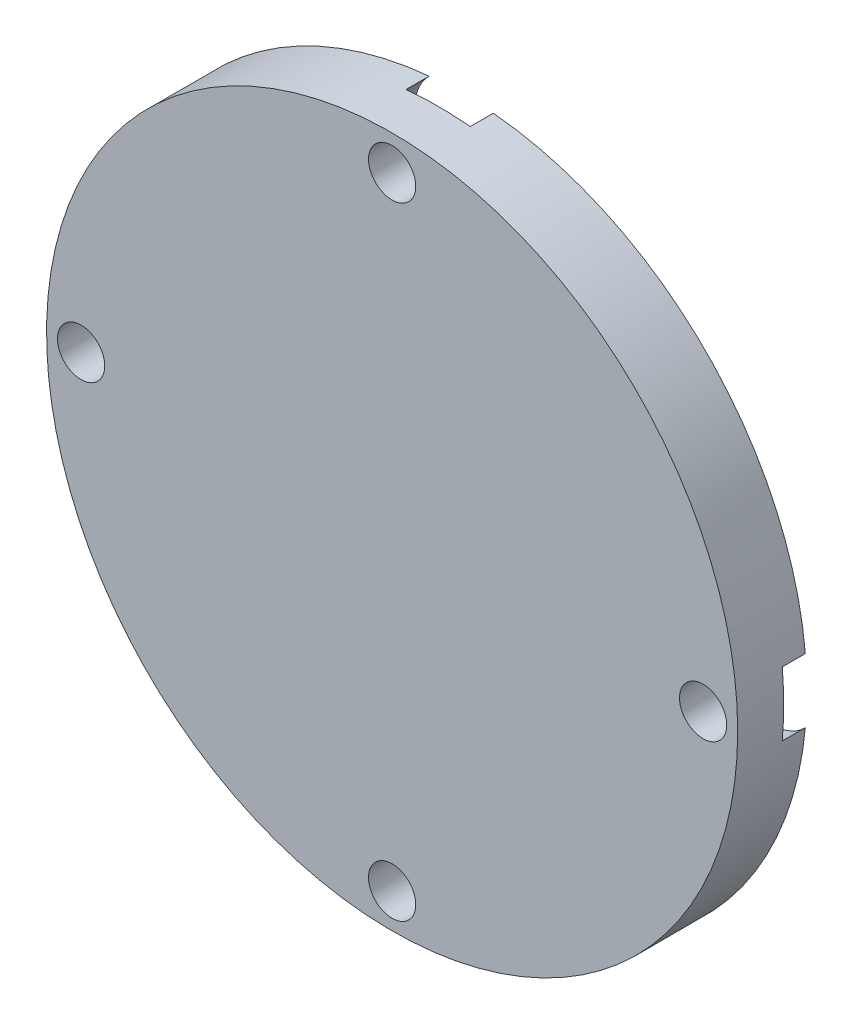
ISO-10303-21;
HEADER;
FILE_DESCRIPTION(('STEP AP214'),'2;1');
FILE_NAME('part.step','',(''),(''),'','','');
FILE_SCHEMA(('AUTOMOTIVE_DESIGN { 1 0 10303 214 1 1 1 1 }'));
ENDSEC;
DATA;
#1=APPLICATION_CONTEXT('core data for automotive mechanical design processes');
#2=APPLICATION_PROTOCOL_DEFINITION('international standard','automotive_design',2000,#1);
#3=PRODUCT_CONTEXT('',#1,'mechanical');
#4=PRODUCT('Part','Part','',(#3));
#5=PRODUCT_RELATED_PRODUCT_CATEGORY('part','',(#4));
#6=PRODUCT_DEFINITION_FORMATION('','',#4);
#7=PRODUCT_DEFINITION_CONTEXT('part definition',#1,'design');
#8=PRODUCT_DEFINITION('design','',#6,#7);
#9=PRODUCT_DEFINITION_SHAPE('','',#8);
#10=(LENGTH_UNIT() NAMED_UNIT(*) SI_UNIT(.MILLI.,.METRE.));
#11=(NAMED_UNIT(*) PLANE_ANGLE_UNIT() SI_UNIT($,.RADIAN.));
#12=(NAMED_UNIT(*) SI_UNIT($,.STERADIAN.) SOLID_ANGLE_UNIT());
#13=UNCERTAINTY_MEASURE_WITH_UNIT(LENGTH_MEASURE(1.E-05),#10,'distance_accuracy_value','');
#14=(GEOMETRIC_REPRESENTATION_CONTEXT(3) GLOBAL_UNCERTAINTY_ASSIGNED_CONTEXT((#13)) GLOBAL_UNIT_ASSIGNED_CONTEXT((#10,
#11,#12)) REPRESENTATION_CONTEXT('',''));
#15=CARTESIAN_POINT('',(0.,0.,0.));
#16=DIRECTION('',(0.,0.,1.));
#17=DIRECTION('',(1.,0.,0.));
#18=AXIS2_PLACEMENT_3D('',#15,#16,#17);
#19=CARTESIAN_POINT('',(-13.4999999999996,-3.8286644072103E-13,3.));
#20=DIRECTION('',(0.,0.,-1.));
#21=DIRECTION('',(-1.,0.,0.));
#22=AXIS2_PLACEMENT_3D('',#19,#20,#21);
#23=CYLINDRICAL_SURFACE('',#22,1.02500000000061);
#24=CARTESIAN_POINT('',(-13.4999999999996,-3.8286644072103E-13,3.));
#25=DIRECTION('',(0.,0.,1.));
#26=DIRECTION('',(1.,0.,0.));
#27=AXIS2_PLACEMENT_3D('',#24,#25,#26);
#28=CIRCLE('',#27,1.02500000000061);
#29=CARTESIAN_POINT('',(-12.474999999999,-3.8286644072103E-13,3.));
#30=VERTEX_POINT('',#29);
#31=EDGE_CURVE('E172',#30,#30,#28,.T.);
#32=ORIENTED_EDGE('',*,*,#31,.T.);
#33=EDGE_LOOP('',(#32));
#34=FACE_BOUND('',#33,.T.);
#35=CARTESIAN_POINT('',(-13.4999999999996,-3.8286644072103E-13,1.));
#36=DIRECTION('',(0.,0.,-1.));
#37=DIRECTION('',(-1.,0.,0.));
#38=AXIS2_PLACEMENT_3D('',#35,#36,#37);
#39=CIRCLE('',#38,1.02500000000061);
#40=CARTESIAN_POINT('',(-14.5250000000002,-3.8286644072103E-13,1.));
#41=VERTEX_POINT('',#40);
#42=EDGE_CURVE('E40',#41,#41,#39,.T.);
#43=ORIENTED_EDGE('',*,*,#42,.T.);
#44=EDGE_LOOP('',(#43));
#45=FACE_BOUND('',#44,.T.);
#46=ADVANCED_FACE('F36',(#34,#45),#23,.F.);
#47=CARTESIAN_POINT('',(7.62426335084362E-13,-13.5,3.));
#48=DIRECTION('',(0.,0.,-1.));
#49=DIRECTION('',(-1.,0.,0.));
#50=AXIS2_PLACEMENT_3D('',#47,#48,#49);
#51=CYLINDRICAL_SURFACE('',#50,1.02500000000082);
#52=CARTESIAN_POINT('',(7.62426335084362E-13,-13.5,3.));
#53=DIRECTION('',(0.,0.,1.));
#54=DIRECTION('',(1.,0.,0.));
#55=AXIS2_PLACEMENT_3D('',#52,#53,#54);
#56=CIRCLE('',#55,1.02500000000082);
#57=CARTESIAN_POINT('',(1.02500000000158,-13.5,3.));
#58=VERTEX_POINT('',#57);
#59=EDGE_CURVE('E179',#58,#58,#56,.T.);
#60=ORIENTED_EDGE('',*,*,#59,.T.);
#61=EDGE_LOOP('',(#60));
#62=FACE_BOUND('',#61,.T.);
#63=CARTESIAN_POINT('',(7.62426335084362E-13,-13.5,1.));
#64=DIRECTION('',(0.,0.,-1.));
#65=DIRECTION('',(-1.,0.,0.));
#66=AXIS2_PLACEMENT_3D('',#63,#64,#65);
#67=CIRCLE('',#66,1.02500000000082);
#68=CARTESIAN_POINT('',(-1.02500000000006,-13.5,1.));
#69=VERTEX_POINT('',#68);
#70=EDGE_CURVE('E144',#69,#69,#67,.T.);
#71=ORIENTED_EDGE('',*,*,#70,.T.);
#72=EDGE_LOOP('',(#71));
#73=FACE_BOUND('',#72,.T.);
#74=ADVANCED_FACE('F201',(#62,#73),#51,.F.);
#75=CARTESIAN_POINT('',(13.5000000000004,3.81213167542181E-13,3.));
#76=DIRECTION('',(0.,0.,-1.));
#77=DIRECTION('',(-1.,0.,0.));
#78=AXIS2_PLACEMENT_3D('',#75,#76,#77);
#79=CYLINDRICAL_SURFACE('',#78,1.0250000000003);
#80=CARTESIAN_POINT('',(13.5000000000004,3.81213167542181E-13,3.));
#81=DIRECTION('',(0.,0.,1.));
#82=DIRECTION('',(1.,0.,0.));
#83=AXIS2_PLACEMENT_3D('',#80,#81,#82);
#84=CIRCLE('',#83,1.0250000000003);
#85=CARTESIAN_POINT('',(14.5250000000007,3.81213167542181E-13,3.));
#86=VERTEX_POINT('',#85);
#87=EDGE_CURVE('E176',#86,#86,#84,.T.);
#88=ORIENTED_EDGE('',*,*,#87,.T.);
#89=EDGE_LOOP('',(#88));
#90=FACE_BOUND('',#89,.T.);
#91=CARTESIAN_POINT('',(13.5000000000004,3.81213167542181E-13,1.));
#92=DIRECTION('',(0.,0.,-1.));
#93=DIRECTION('',(-1.,0.,0.));
#94=AXIS2_PLACEMENT_3D('',#91,#92,#93);
#95=CIRCLE('',#94,1.0250000000003);
#96=CARTESIAN_POINT('',(12.4750000000001,3.81213167542181E-13,1.));
#97=VERTEX_POINT('',#96);
#98=EDGE_CURVE('E141',#97,#97,#95,.T.);
#99=ORIENTED_EDGE('',*,*,#98,.T.);
#100=EDGE_LOOP('',(#99));
#101=FACE_BOUND('',#100,.T.);
#102=ADVANCED_FACE('F197',(#90,#101),#79,.F.);
#103=CARTESIAN_POINT('',(0.,13.5,3.));
#104=DIRECTION('',(0.,0.,-1.));
#105=DIRECTION('',(-1.,0.,0.));
#106=AXIS2_PLACEMENT_3D('',#103,#104,#105);
#107=CYLINDRICAL_SURFACE('',#106,1.025);
#108=CARTESIAN_POINT('',(0.,13.5,3.));
#109=DIRECTION('',(0.,0.,1.));
#110=DIRECTION('',(1.,0.,0.));
#111=AXIS2_PLACEMENT_3D('',#108,#109,#110);
#112=CIRCLE('',#111,1.025);
#113=CARTESIAN_POINT('',(1.025,13.5,3.));
#114=VERTEX_POINT('',#113);
#115=EDGE_CURVE('E173',#114,#114,#112,.T.);
#116=ORIENTED_EDGE('',*,*,#115,.T.);
#117=EDGE_LOOP('',(#116));
#118=FACE_BOUND('',#117,.T.);
#119=CARTESIAN_POINT('',(0.,13.5,1.));
#120=DIRECTION('',(0.,0.,-1.));
#121=DIRECTION('',(-1.,0.,0.));
#122=AXIS2_PLACEMENT_3D('',#119,#120,#121);
#123=CIRCLE('',#122,1.025);
#124=CARTESIAN_POINT('',(-1.025,13.5,1.));
#125=VERTEX_POINT('',#124);
#126=EDGE_CURVE('E138',#125,#125,#123,.T.);
#127=ORIENTED_EDGE('',*,*,#126,.T.);
#128=EDGE_LOOP('',(#127));
#129=FACE_BOUND('',#128,.T.);
#130=ADVANCED_FACE('F193',(#118,#129),#107,.F.);
#131=CARTESIAN_POINT('',(0.,0.,3.));
#132=DIRECTION('',(0.,0.,-1.));
#133=DIRECTION('',(-1.,0.,0.));
#134=AXIS2_PLACEMENT_3D('',#131,#132,#133);
#135=CYLINDRICAL_SURFACE('',#134,15.);
#136=CARTESIAN_POINT('',(0.,0.,0.));
#137=DIRECTION('',(0.,0.,1.));
#138=DIRECTION('',(1.,0.,0.));
#139=AXIS2_PLACEMENT_3D('',#136,#137,#138);
#140=CIRCLE('',#139,15.);
#141=CARTESIAN_POINT('',(14.9351851851851,1.39292623071985,0.));
#142=VERTEX_POINT('',#141);
#143=CARTESIAN_POINT('',(1.39292623071895,14.9351851851852,0.));
#144=VERTEX_POINT('',#143);
#145=EDGE_CURVE('E45',#142,#144,#140,.T.);
#146=ORIENTED_EDGE('',*,*,#145,.T.);
#147=DIRECTION('',(0.,0.,-1.));
#148=VECTOR('',#147,1.);
#149=CARTESIAN_POINT('',(1.39292623071896,14.9351851851852,0.5));
#150=LINE('',#149,#148);
#151=CARTESIAN_POINT('',(1.39292623071897,14.9351851851852,1.));
#152=VERTEX_POINT('',#151);
#153=EDGE_CURVE('E111',#144,#152,#150,.F.);
#154=ORIENTED_EDGE('',*,*,#153,.T.);
#155=CARTESIAN_POINT('',(0.,0.,1.));
#156=DIRECTION('',(0.,0.,-1.));
#157=DIRECTION('',(-1.,0.,0.));
#158=AXIS2_PLACEMENT_3D('',#155,#156,#157);
#159=CIRCLE('',#158,15.);
#160=CARTESIAN_POINT('',(-1.39292623071897,14.9351851851852,1.));
#161=VERTEX_POINT('',#160);
#162=EDGE_CURVE('E125',#161,#152,#159,.T.);
#163=ORIENTED_EDGE('',*,*,#162,.F.);
#164=DIRECTION('',(0.,0.,-1.));
#165=VECTOR('',#164,1.);
#166=CARTESIAN_POINT('',(-1.39292623071896,14.9351851851852,0.5));
#167=LINE('',#166,#165);
#168=CARTESIAN_POINT('',(-1.39292623071896,14.9351851851852,0.));
#169=VERTEX_POINT('',#168);
#170=EDGE_CURVE('E108',#161,#169,#167,.T.);
#171=ORIENTED_EDGE('',*,*,#170,.T.);
#172=CARTESIAN_POINT('',(-14.9351851851853,1.39292623071812,0.));
#173=VERTEX_POINT('',#172);
#174=EDGE_CURVE('E124',#169,#173,#140,.T.);
#175=ORIENTED_EDGE('',*,*,#174,.T.);
#176=DIRECTION('',(0.,0.,-1.));
#177=VECTOR('',#176,1.);
#178=CARTESIAN_POINT('',(-14.9351851851853,1.39292623071812,0.5));
#179=LINE('',#178,#177);
#180=CARTESIAN_POINT('',(-14.9351851851853,1.39292623071812,1.));
#181=VERTEX_POINT('',#180);
#182=EDGE_CURVE('E126',#173,#181,#179,.F.);
#183=ORIENTED_EDGE('',*,*,#182,.T.);
#184=CARTESIAN_POINT('',(0.,0.,1.));
#185=DIRECTION('',(0.,0.,-1.));
#186=DIRECTION('',(-1.,0.,0.));
#187=AXIS2_PLACEMENT_3D('',#184,#185,#186);
#188=CIRCLE('',#187,15.);
#189=CARTESIAN_POINT('',(-14.9351851851852,-1.39292623071897,1.));
#190=VERTEX_POINT('',#189);
#191=EDGE_CURVE('E157',#190,#181,#188,.T.);
#192=ORIENTED_EDGE('',*,*,#191,.F.);
#193=DIRECTION('',(0.,0.,-1.));
#194=VECTOR('',#193,1.);
#195=CARTESIAN_POINT('',(-14.9351851851852,-1.39292623071897,0.5));
#196=LINE('',#195,#194);
#197=CARTESIAN_POINT('',(-14.9351851851852,-1.39292623071897,0.));
#198=VERTEX_POINT('',#197);
#199=EDGE_CURVE('E167',#190,#198,#196,.T.);
#200=ORIENTED_EDGE('',*,*,#199,.T.);
#201=CARTESIAN_POINT('',(-1.39292623071815,-14.9351851851853,0.));
#202=VERTEX_POINT('',#201);
#203=EDGE_CURVE('E132',#198,#202,#140,.T.);
#204=ORIENTED_EDGE('',*,*,#203,.T.);
#205=DIRECTION('',(0.,0.,-1.));
#206=VECTOR('',#205,1.);
#207=CARTESIAN_POINT('',(-1.39292623071814,-14.9351851851853,0.5));
#208=LINE('',#207,#206);
#209=CARTESIAN_POINT('',(-1.39292623071813,-14.9351851851853,1.));
#210=VERTEX_POINT('',#209);
#211=EDGE_CURVE('E61',#202,#210,#208,.F.);
#212=ORIENTED_EDGE('',*,*,#211,.T.);
#213=CARTESIAN_POINT('',(0.,0.,1.));
#214=DIRECTION('',(0.,0.,-1.));
#215=DIRECTION('',(-1.,0.,0.));
#216=AXIS2_PLACEMENT_3D('',#213,#214,#215);
#217=CIRCLE('',#216,15.);
#218=CARTESIAN_POINT('',(1.39292623071982,-14.9351851851851,1.));
#219=VERTEX_POINT('',#218);
#220=EDGE_CURVE('E146',#219,#210,#217,.T.);
#221=ORIENTED_EDGE('',*,*,#220,.F.);
#222=DIRECTION('',(0.,0.,-1.));
#223=VECTOR('',#222,1.);
#224=CARTESIAN_POINT('',(1.39292623071983,-14.9351851851851,0.5));
#225=LINE('',#224,#223);
#226=CARTESIAN_POINT('',(1.39292623071983,-14.9351851851851,0.));
#227=VERTEX_POINT('',#226);
#228=EDGE_CURVE('E159',#219,#227,#225,.T.);
#229=ORIENTED_EDGE('',*,*,#228,.T.);
#230=CARTESIAN_POINT('',(14.9351851851852,-1.39292623071902,0.));
#231=VERTEX_POINT('',#230);
#232=EDGE_CURVE('E134',#227,#231,#140,.T.);
#233=ORIENTED_EDGE('',*,*,#232,.T.);
#234=DIRECTION('',(0.,0.,-1.));
#235=VECTOR('',#234,1.);
#236=CARTESIAN_POINT('',(14.9351851851852,-1.392926230719,0.5));
#237=LINE('',#236,#235);
#238=CARTESIAN_POINT('',(14.9351851851852,-1.39292623071899,1.));
#239=VERTEX_POINT('',#238);
#240=EDGE_CURVE('E53',#231,#239,#237,.F.);
#241=ORIENTED_EDGE('',*,*,#240,.T.);
#242=CARTESIAN_POINT('',(0.,0.,1.));
#243=DIRECTION('',(0.,0.,-1.));
#244=DIRECTION('',(-1.,0.,0.));
#245=AXIS2_PLACEMENT_3D('',#242,#243,#244);
#246=CIRCLE('',#245,15.);
#247=CARTESIAN_POINT('',(14.9351851851851,1.39292623071983,1.));
#248=VERTEX_POINT('',#247);
#249=EDGE_CURVE('E143',#248,#239,#246,.T.);
#250=ORIENTED_EDGE('',*,*,#249,.F.);
#251=DIRECTION('',(0.,0.,-1.));
#252=VECTOR('',#251,1.);
#253=CARTESIAN_POINT('',(14.9351851851851,1.39292623071985,0.5));
#254=LINE('',#253,#252);
#255=EDGE_CURVE('E163',#248,#142,#254,.T.);
#256=ORIENTED_EDGE('',*,*,#255,.T.);
#257=EDGE_LOOP('',(#146,#154,#163,#171,#175,#183,#192,#200,#204,#212,#221,#229,#233,#241,#250,#256));
#258=FACE_BOUND('',#257,.T.);
#259=CARTESIAN_POINT('',(0.,0.,3.));
#260=DIRECTION('',(0.,0.,1.));
#261=DIRECTION('',(1.,0.,0.));
#262=AXIS2_PLACEMENT_3D('',#259,#260,#261);
#263=CIRCLE('',#262,15.);
#264=CARTESIAN_POINT('',(15.,0.,3.));
#265=VERTEX_POINT('',#264);
#266=EDGE_CURVE('E11',#265,#265,#263,.T.);
#267=ORIENTED_EDGE('',*,*,#266,.F.);
#268=EDGE_LOOP('',(#267));
#269=FACE_BOUND('',#268,.T.);
#270=ADVANCED_FACE('F38',(#258,#269),#135,.T.);
#271=CARTESIAN_POINT('',(0.,0.,3.));
#272=DIRECTION('',(0.,0.,1.));
#273=DIRECTION('',(1.,0.,0.));
#274=AXIS2_PLACEMENT_3D('',#271,#272,#273);
#275=PLANE('',#274);
#276=ORIENTED_EDGE('',*,*,#115,.F.);
#277=EDGE_LOOP('',(#276));
#278=FACE_BOUND('',#277,.T.);
#279=ORIENTED_EDGE('',*,*,#87,.F.);
#280=EDGE_LOOP('',(#279));
#281=FACE_BOUND('',#280,.T.);
#282=ORIENTED_EDGE('',*,*,#59,.F.);
#283=EDGE_LOOP('',(#282));
#284=FACE_BOUND('',#283,.T.);
#285=ORIENTED_EDGE('',*,*,#31,.F.);
#286=EDGE_LOOP('',(#285));
#287=FACE_BOUND('',#286,.T.);
#288=ORIENTED_EDGE('',*,*,#266,.T.);
#289=EDGE_LOOP('',(#288));
#290=FACE_BOUND('',#289,.T.);
#291=ADVANCED_FACE('F186',(#278,#281,#284,#287,#290),#275,.T.);
#292=CARTESIAN_POINT('',(0.,0.,0.));
#293=DIRECTION('',(0.,0.,1.));
#294=DIRECTION('',(1.,0.,0.));
#295=AXIS2_PLACEMENT_3D('',#292,#293,#294);
#296=PLANE('',#295);
#297=ORIENTED_EDGE('',*,*,#174,.F.);
#298=CARTESIAN_POINT('',(0.,13.5,0.));
#299=DIRECTION('',(0.,0.,-1.));
#300=DIRECTION('',(-1.,0.,0.));
#301=AXIS2_PLACEMENT_3D('',#298,#299,#300);
#302=CIRCLE('',#301,2.);
#303=EDGE_CURVE('E104',#144,#169,#302,.T.);
#304=ORIENTED_EDGE('',*,*,#303,.F.);
#305=ORIENTED_EDGE('',*,*,#145,.F.);
#306=CARTESIAN_POINT('',(13.5000000000004,3.81213167542181E-13,0.));
#307=DIRECTION('',(0.,0.,-1.));
#308=DIRECTION('',(-1.,0.,0.));
#309=AXIS2_PLACEMENT_3D('',#306,#307,#308);
#310=CIRCLE('',#309,2.);
#311=EDGE_CURVE('E338',#231,#142,#310,.T.);
#312=ORIENTED_EDGE('',*,*,#311,.F.);
#313=ORIENTED_EDGE('',*,*,#232,.F.);
#314=CARTESIAN_POINT('',(7.62426335084362E-13,-13.5,0.));
#315=DIRECTION('',(0.,0.,-1.));
#316=DIRECTION('',(-1.,0.,0.));
#317=AXIS2_PLACEMENT_3D('',#314,#315,#316);
#318=CIRCLE('',#317,2.);
#319=EDGE_CURVE('E332',#202,#227,#318,.T.);
#320=ORIENTED_EDGE('',*,*,#319,.F.);
#321=ORIENTED_EDGE('',*,*,#203,.F.);
#322=CARTESIAN_POINT('',(-13.4999999999996,-3.8286644072103E-13,0.));
#323=DIRECTION('',(0.,0.,-1.));
#324=DIRECTION('',(-1.,0.,0.));
#325=AXIS2_PLACEMENT_3D('',#322,#323,#324);
#326=CIRCLE('',#325,2.);
#327=EDGE_CURVE('E131',#173,#198,#326,.T.);
#328=ORIENTED_EDGE('',*,*,#327,.F.);
#329=EDGE_LOOP('',(#297,#304,#305,#312,#313,#320,#321,#328));
#330=FACE_BOUND('',#329,.T.);
#331=ADVANCED_FACE('F129',(#330),#296,.F.);
#332=CARTESIAN_POINT('',(0.,13.5,1.));
#333=DIRECTION('',(0.,0.,-1.));
#334=DIRECTION('',(-1.,0.,0.));
#335=AXIS2_PLACEMENT_3D('',#332,#333,#334);
#336=CYLINDRICAL_SURFACE('',#335,2.);
#337=ORIENTED_EDGE('',*,*,#303,.T.);
#338=ORIENTED_EDGE('',*,*,#170,.F.);
#339=CARTESIAN_POINT('',(0.,13.5,1.));
#340=DIRECTION('',(0.,0.,-1.));
#341=DIRECTION('',(-1.,0.,0.));
#342=AXIS2_PLACEMENT_3D('',#339,#340,#341);
#343=CIRCLE('',#342,2.);
#344=EDGE_CURVE('E116',#152,#161,#343,.T.);
#345=ORIENTED_EDGE('',*,*,#344,.F.);
#346=ORIENTED_EDGE('',*,*,#153,.F.);
#347=EDGE_LOOP('',(#337,#338,#345,#346));
#348=FACE_BOUND('',#347,.T.);
#349=ADVANCED_FACE('F106',(#348),#336,.F.);
#350=CARTESIAN_POINT('',(0.,13.5,1.));
#351=DIRECTION('',(0.,0.,-1.));
#352=DIRECTION('',(-1.,0.,0.));
#353=AXIS2_PLACEMENT_3D('',#350,#351,#352);
#354=PLANE('',#353);
#355=ORIENTED_EDGE('',*,*,#126,.F.);
#356=EDGE_LOOP('',(#355));
#357=FACE_BOUND('',#356,.T.);
#358=ORIENTED_EDGE('',*,*,#162,.T.);
#359=ORIENTED_EDGE('',*,*,#344,.T.);
#360=EDGE_LOOP('',(#358,#359));
#361=FACE_BOUND('',#360,.T.);
#362=ADVANCED_FACE('F213',(#357,#361),#354,.T.);
#363=CARTESIAN_POINT('',(13.5000000000004,3.81213167542181E-13,1.));
#364=DIRECTION('',(0.,0.,-1.));
#365=DIRECTION('',(-1.,0.,0.));
#366=AXIS2_PLACEMENT_3D('',#363,#364,#365);
#367=CYLINDRICAL_SURFACE('',#366,2.);
#368=ORIENTED_EDGE('',*,*,#311,.T.);
#369=ORIENTED_EDGE('',*,*,#255,.F.);
#370=CARTESIAN_POINT('',(13.5000000000004,3.81213167542181E-13,1.));
#371=DIRECTION('',(0.,0.,-1.));
#372=DIRECTION('',(-1.,0.,0.));
#373=AXIS2_PLACEMENT_3D('',#370,#371,#372);
#374=CIRCLE('',#373,2.);
#375=EDGE_CURVE('E339',#239,#248,#374,.T.);
#376=ORIENTED_EDGE('',*,*,#375,.F.);
#377=ORIENTED_EDGE('',*,*,#240,.F.);
#378=EDGE_LOOP('',(#368,#369,#376,#377));
#379=FACE_BOUND('',#378,.T.);
#380=ADVANCED_FACE('F218',(#379),#367,.F.);
#381=CARTESIAN_POINT('',(13.5000000000004,3.81213167542181E-13,1.));
#382=DIRECTION('',(0.,0.,-1.));
#383=DIRECTION('',(-1.,0.,0.));
#384=AXIS2_PLACEMENT_3D('',#381,#382,#383);
#385=PLANE('',#384);
#386=ORIENTED_EDGE('',*,*,#98,.F.);
#387=EDGE_LOOP('',(#386));
#388=FACE_BOUND('',#387,.T.);
#389=ORIENTED_EDGE('',*,*,#249,.T.);
#390=ORIENTED_EDGE('',*,*,#375,.T.);
#391=EDGE_LOOP('',(#389,#390));
#392=FACE_BOUND('',#391,.T.);
#393=ADVANCED_FACE('F231',(#388,#392),#385,.T.);
#394=CARTESIAN_POINT('',(7.62426335084362E-13,-13.5,1.));
#395=DIRECTION('',(0.,0.,-1.));
#396=DIRECTION('',(-1.,0.,0.));
#397=AXIS2_PLACEMENT_3D('',#394,#395,#396);
#398=CYLINDRICAL_SURFACE('',#397,2.);
#399=ORIENTED_EDGE('',*,*,#319,.T.);
#400=ORIENTED_EDGE('',*,*,#228,.F.);
#401=CARTESIAN_POINT('',(7.62426335084362E-13,-13.5,1.));
#402=DIRECTION('',(0.,0.,-1.));
#403=DIRECTION('',(-1.,0.,0.));
#404=AXIS2_PLACEMENT_3D('',#401,#402,#403);
#405=CIRCLE('',#404,2.);
#406=EDGE_CURVE('E335',#210,#219,#405,.T.);
#407=ORIENTED_EDGE('',*,*,#406,.F.);
#408=ORIENTED_EDGE('',*,*,#211,.F.);
#409=EDGE_LOOP('',(#399,#400,#407,#408));
#410=FACE_BOUND('',#409,.T.);
#411=ADVANCED_FACE('F234',(#410),#398,.F.);
#412=CARTESIAN_POINT('',(7.62426335084362E-13,-13.5,1.));
#413=DIRECTION('',(0.,0.,-1.));
#414=DIRECTION('',(-1.,0.,0.));
#415=AXIS2_PLACEMENT_3D('',#412,#413,#414);
#416=PLANE('',#415);
#417=ORIENTED_EDGE('',*,*,#70,.F.);
#418=EDGE_LOOP('',(#417));
#419=FACE_BOUND('',#418,.T.);
#420=ORIENTED_EDGE('',*,*,#220,.T.);
#421=ORIENTED_EDGE('',*,*,#406,.T.);
#422=EDGE_LOOP('',(#420,#421));
#423=FACE_BOUND('',#422,.T.);
#424=ADVANCED_FACE('F229',(#419,#423),#416,.T.);
#425=CARTESIAN_POINT('',(-13.4999999999996,-3.8286644072103E-13,1.));
#426=DIRECTION('',(0.,0.,-1.));
#427=DIRECTION('',(-1.,0.,0.));
#428=AXIS2_PLACEMENT_3D('',#425,#426,#427);
#429=CYLINDRICAL_SURFACE('',#428,2.);
#430=ORIENTED_EDGE('',*,*,#327,.T.);
#431=ORIENTED_EDGE('',*,*,#199,.F.);
#432=CARTESIAN_POINT('',(-13.4999999999996,-3.8286644072103E-13,1.));
#433=DIRECTION('',(0.,0.,-1.));
#434=DIRECTION('',(-1.,0.,0.));
#435=AXIS2_PLACEMENT_3D('',#432,#433,#434);
#436=CIRCLE('',#435,2.);
#437=EDGE_CURVE('E117',#181,#190,#436,.T.);
#438=ORIENTED_EDGE('',*,*,#437,.F.);
#439=ORIENTED_EDGE('',*,*,#182,.F.);
#440=EDGE_LOOP('',(#430,#431,#438,#439));
#441=FACE_BOUND('',#440,.T.);
#442=ADVANCED_FACE('F225',(#441),#429,.F.);
#443=CARTESIAN_POINT('',(-13.4999999999996,-3.8286644072103E-13,1.));
#444=DIRECTION('',(0.,0.,-1.));
#445=DIRECTION('',(-1.,0.,0.));
#446=AXIS2_PLACEMENT_3D('',#443,#444,#445);
#447=PLANE('',#446);
#448=ORIENTED_EDGE('',*,*,#42,.F.);
#449=EDGE_LOOP('',(#448));
#450=FACE_BOUND('',#449,.T.);
#451=ORIENTED_EDGE('',*,*,#191,.T.);
#452=ORIENTED_EDGE('',*,*,#437,.T.);
#453=EDGE_LOOP('',(#451,#452));
#454=FACE_BOUND('',#453,.T.);
#455=ADVANCED_FACE('F222',(#450,#454),#447,.T.);
#456=CLOSED_SHELL('',(#46,#74,#102,#130,#270,#291,#331,#349,#362,#380,#393,#411,#424,#442,#455));
#457=MANIFOLD_SOLID_BREP('B2',#456);
#458=ADVANCED_BREP_SHAPE_REPRESENTATION('',(#18,#457),#14);
#459=SHAPE_DEFINITION_REPRESENTATION(#9,#458);
ENDSEC;
END-ISO-10303-21;
